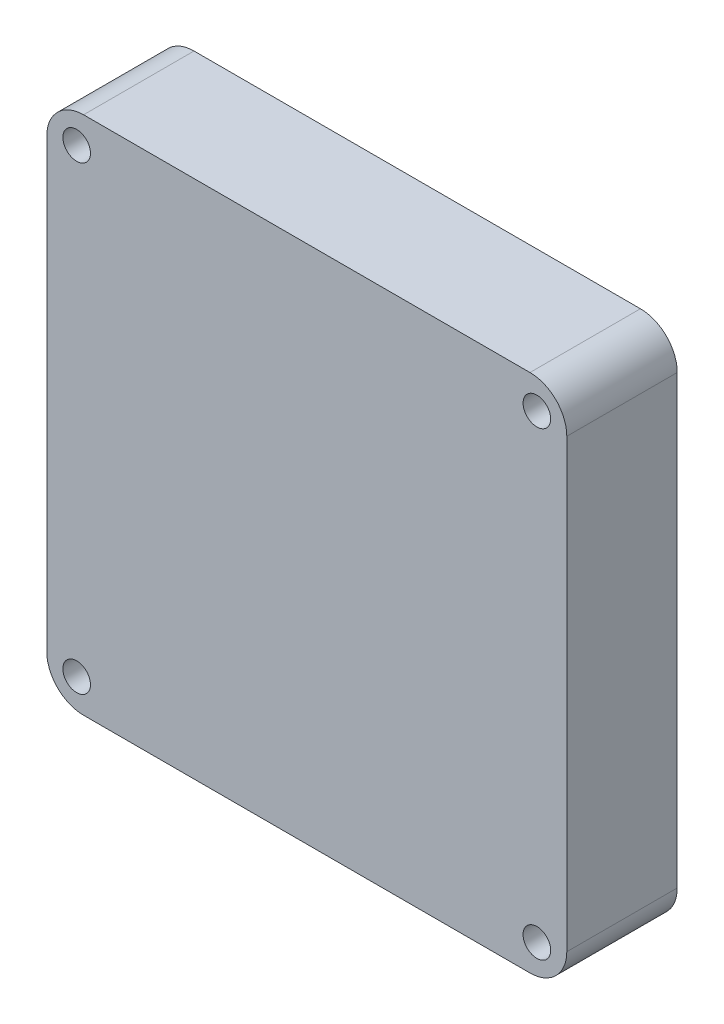
ISO-10303-21;
HEADER;
FILE_DESCRIPTION(('STEP AP214'),'2;1');
FILE_NAME('part.step','',(''),(''),'','','');
FILE_SCHEMA(('AUTOMOTIVE_DESIGN { 1 0 10303 214 1 1 1 1 }'));
ENDSEC;
DATA;
#1=APPLICATION_CONTEXT('core data for automotive mechanical design processes');
#2=APPLICATION_PROTOCOL_DEFINITION('international standard','automotive_design',2000,#1);
#3=PRODUCT_CONTEXT('',#1,'mechanical');
#4=PRODUCT('Part','Part','',(#3));
#5=PRODUCT_RELATED_PRODUCT_CATEGORY('part','',(#4));
#6=PRODUCT_DEFINITION_FORMATION('','',#4);
#7=PRODUCT_DEFINITION_CONTEXT('part definition',#1,'design');
#8=PRODUCT_DEFINITION('design','',#6,#7);
#9=PRODUCT_DEFINITION_SHAPE('','',#8);
#10=(LENGTH_UNIT() NAMED_UNIT(*) SI_UNIT(.MILLI.,.METRE.));
#11=(NAMED_UNIT(*) PLANE_ANGLE_UNIT() SI_UNIT($,.RADIAN.));
#12=(NAMED_UNIT(*) SI_UNIT($,.STERADIAN.) SOLID_ANGLE_UNIT());
#13=UNCERTAINTY_MEASURE_WITH_UNIT(LENGTH_MEASURE(1.E-05),#10,'distance_accuracy_value','');
#14=(GEOMETRIC_REPRESENTATION_CONTEXT(3) GLOBAL_UNCERTAINTY_ASSIGNED_CONTEXT((#13)) GLOBAL_UNIT_ASSIGNED_CONTEXT((#10,
#11,#12)) REPRESENTATION_CONTEXT('',''));
#15=CARTESIAN_POINT('',(0.,0.,0.));
#16=DIRECTION('',(0.,0.,1.));
#17=DIRECTION('',(1.,0.,0.));
#18=AXIS2_PLACEMENT_3D('',#15,#16,#17);
#19=CARTESIAN_POINT('',(0.,0.,12.));
#20=DIRECTION('',(0.,0.,1.));
#21=DIRECTION('',(1.,0.,0.));
#22=AXIS2_PLACEMENT_3D('',#19,#20,#21);
#23=PLANE('',#22);
#24=CARTESIAN_POINT('',(25.0000000000001,-24.9999999999999,12.));
#25=DIRECTION('',(0.,0.,1.));
#26=DIRECTION('',(1.,0.,0.));
#27=AXIS2_PLACEMENT_3D('',#24,#25,#26);
#28=CIRCLE('',#27,1.5);
#29=CARTESIAN_POINT('',(26.5000000000001,-24.9999999999999,12.));
#30=VERTEX_POINT('',#29);
#31=EDGE_CURVE('E185',#30,#30,#28,.T.);
#32=ORIENTED_EDGE('',*,*,#31,.F.);
#33=EDGE_LOOP('',(#32));
#34=FACE_BOUND('',#33,.T.);
#35=CARTESIAN_POINT('',(-25.,25.,12.));
#36=DIRECTION('',(0.,0.,1.));
#37=DIRECTION('',(1.,0.,0.));
#38=AXIS2_PLACEMENT_3D('',#35,#36,#37);
#39=CIRCLE('',#38,1.5);
#40=CARTESIAN_POINT('',(-23.5,25.,12.));
#41=VERTEX_POINT('',#40);
#42=EDGE_CURVE('E169',#41,#41,#39,.T.);
#43=ORIENTED_EDGE('',*,*,#42,.F.);
#44=EDGE_LOOP('',(#43));
#45=FACE_BOUND('',#44,.T.);
#46=DIRECTION('',(0.,-1.,0.));
#47=VECTOR('',#46,1.);
#48=CARTESIAN_POINT('',(-28.25,28.25,12.));
#49=LINE('',#48,#47);
#50=CARTESIAN_POINT('',(-28.25,24.25,12.));
#51=VERTEX_POINT('',#50);
#52=CARTESIAN_POINT('',(-28.25,-24.25,12.));
#53=VERTEX_POINT('',#52);
#54=EDGE_CURVE('E173',#51,#53,#49,.T.);
#55=ORIENTED_EDGE('',*,*,#54,.T.);
#56=CARTESIAN_POINT('',(-24.25,-24.25,12.));
#57=DIRECTION('',(0.,0.,1.));
#58=DIRECTION('',(1.,0.,0.));
#59=AXIS2_PLACEMENT_3D('',#56,#57,#58);
#60=CIRCLE('',#59,4.);
#61=CARTESIAN_POINT('',(-24.25,-28.25,12.));
#62=VERTEX_POINT('',#61);
#63=EDGE_CURVE('E150',#53,#62,#60,.T.);
#64=ORIENTED_EDGE('',*,*,#63,.T.);
#65=DIRECTION('',(1.,0.,0.));
#66=VECTOR('',#65,1.);
#67=CARTESIAN_POINT('',(-28.25,-28.25,12.));
#68=LINE('',#67,#66);
#69=CARTESIAN_POINT('',(24.25,-28.25,12.));
#70=VERTEX_POINT('',#69);
#71=EDGE_CURVE('E121',#62,#70,#68,.T.);
#72=ORIENTED_EDGE('',*,*,#71,.T.);
#73=CARTESIAN_POINT('',(24.25,-24.25,12.));
#74=DIRECTION('',(0.,0.,1.));
#75=DIRECTION('',(1.,0.,0.));
#76=AXIS2_PLACEMENT_3D('',#73,#74,#75);
#77=CIRCLE('',#76,4.);
#78=CARTESIAN_POINT('',(28.25,-24.25,12.));
#79=VERTEX_POINT('',#78);
#80=EDGE_CURVE('E146',#70,#79,#77,.T.);
#81=ORIENTED_EDGE('',*,*,#80,.T.);
#82=DIRECTION('',(0.,1.,0.));
#83=VECTOR('',#82,1.);
#84=CARTESIAN_POINT('',(28.25,28.25,12.));
#85=LINE('',#84,#83);
#86=CARTESIAN_POINT('',(28.25,24.25,12.));
#87=VERTEX_POINT('',#86);
#88=EDGE_CURVE('E129',#79,#87,#85,.T.);
#89=ORIENTED_EDGE('',*,*,#88,.T.);
#90=CARTESIAN_POINT('',(24.25,24.25,12.));
#91=DIRECTION('',(0.,0.,1.));
#92=DIRECTION('',(1.,0.,0.));
#93=AXIS2_PLACEMENT_3D('',#90,#91,#92);
#94=CIRCLE('',#93,4.);
#95=CARTESIAN_POINT('',(24.25,28.25,12.));
#96=VERTEX_POINT('',#95);
#97=EDGE_CURVE('E56',#87,#96,#94,.T.);
#98=ORIENTED_EDGE('',*,*,#97,.T.);
#99=DIRECTION('',(-1.,0.,0.));
#100=VECTOR('',#99,1.);
#101=CARTESIAN_POINT('',(-28.25,28.25,12.));
#102=LINE('',#101,#100);
#103=CARTESIAN_POINT('',(-24.25,28.25,12.));
#104=VERTEX_POINT('',#103);
#105=EDGE_CURVE('E132',#96,#104,#102,.T.);
#106=ORIENTED_EDGE('',*,*,#105,.T.);
#107=CARTESIAN_POINT('',(-24.25,24.25,12.));
#108=DIRECTION('',(0.,0.,1.));
#109=DIRECTION('',(1.,0.,0.));
#110=AXIS2_PLACEMENT_3D('',#107,#108,#109);
#111=CIRCLE('',#110,4.);
#112=EDGE_CURVE('E148',#104,#51,#111,.T.);
#113=ORIENTED_EDGE('',*,*,#112,.T.);
#114=EDGE_LOOP('',(#55,#64,#72,#81,#89,#98,#106,#113));
#115=FACE_BOUND('',#114,.T.);
#116=CARTESIAN_POINT('',(25.0000000000001,25.0000000000001,12.));
#117=DIRECTION('',(0.,0.,1.));
#118=DIRECTION('',(1.,0.,0.));
#119=AXIS2_PLACEMENT_3D('',#116,#117,#118);
#120=CIRCLE('',#119,1.5);
#121=CARTESIAN_POINT('',(26.5000000000001,25.0000000000001,12.));
#122=VERTEX_POINT('',#121);
#123=EDGE_CURVE('E179',#122,#122,#120,.T.);
#124=ORIENTED_EDGE('',*,*,#123,.F.);
#125=EDGE_LOOP('',(#124));
#126=FACE_BOUND('',#125,.T.);
#127=CARTESIAN_POINT('',(-24.9999999999999,-24.9999999999999,12.));
#128=DIRECTION('',(0.,0.,1.));
#129=DIRECTION('',(1.,0.,0.));
#130=AXIS2_PLACEMENT_3D('',#127,#128,#129);
#131=CIRCLE('',#130,1.5);
#132=CARTESIAN_POINT('',(-23.4999999999999,-24.9999999999999,12.));
#133=VERTEX_POINT('',#132);
#134=EDGE_CURVE('E191',#133,#133,#131,.T.);
#135=ORIENTED_EDGE('',*,*,#134,.F.);
#136=EDGE_LOOP('',(#135));
#137=FACE_BOUND('',#136,.T.);
#138=ADVANCED_FACE('F34',(#34,#45,#115,#126,#137),#23,.T.);
#139=CARTESIAN_POINT('',(0.,0.,0.));
#140=DIRECTION('',(0.,0.,1.));
#141=DIRECTION('',(1.,0.,0.));
#142=AXIS2_PLACEMENT_3D('',#139,#140,#141);
#143=PLANE('',#142);
#144=DIRECTION('',(1.,0.,0.));
#145=VECTOR('',#144,1.);
#146=CARTESIAN_POINT('',(-28.25,-28.25,0.));
#147=LINE('',#146,#145);
#148=CARTESIAN_POINT('',(-24.25,-28.25,0.));
#149=VERTEX_POINT('',#148);
#150=CARTESIAN_POINT('',(24.25,-28.25,0.));
#151=VERTEX_POINT('',#150);
#152=EDGE_CURVE('E118',#149,#151,#147,.T.);
#153=ORIENTED_EDGE('',*,*,#152,.F.);
#154=CARTESIAN_POINT('',(-24.25,-24.25,0.));
#155=DIRECTION('',(0.,0.,1.));
#156=DIRECTION('',(1.,0.,0.));
#157=AXIS2_PLACEMENT_3D('',#154,#155,#156);
#158=CIRCLE('',#157,4.);
#159=CARTESIAN_POINT('',(-28.25,-24.25,0.));
#160=VERTEX_POINT('',#159);
#161=EDGE_CURVE('E101',#149,#160,#158,.F.);
#162=ORIENTED_EDGE('',*,*,#161,.T.);
#163=DIRECTION('',(0.,-1.,0.));
#164=VECTOR('',#163,1.);
#165=CARTESIAN_POINT('',(-28.25,28.25,0.));
#166=LINE('',#165,#164);
#167=CARTESIAN_POINT('',(-28.25,24.25,0.));
#168=VERTEX_POINT('',#167);
#169=EDGE_CURVE('E130',#168,#160,#166,.T.);
#170=ORIENTED_EDGE('',*,*,#169,.F.);
#171=CARTESIAN_POINT('',(-24.25,24.25,0.));
#172=DIRECTION('',(0.,0.,1.));
#173=DIRECTION('',(1.,0.,0.));
#174=AXIS2_PLACEMENT_3D('',#171,#172,#173);
#175=CIRCLE('',#174,4.);
#176=CARTESIAN_POINT('',(-24.25,28.25,0.));
#177=VERTEX_POINT('',#176);
#178=EDGE_CURVE('E112',#168,#177,#175,.F.);
#179=ORIENTED_EDGE('',*,*,#178,.T.);
#180=DIRECTION('',(-1.,0.,0.));
#181=VECTOR('',#180,1.);
#182=CARTESIAN_POINT('',(-28.25,28.25,0.));
#183=LINE('',#182,#181);
#184=CARTESIAN_POINT('',(24.25,28.25,0.));
#185=VERTEX_POINT('',#184);
#186=EDGE_CURVE('E134',#185,#177,#183,.T.);
#187=ORIENTED_EDGE('',*,*,#186,.F.);
#188=CARTESIAN_POINT('',(24.25,24.25,0.));
#189=DIRECTION('',(0.,0.,1.));
#190=DIRECTION('',(1.,0.,0.));
#191=AXIS2_PLACEMENT_3D('',#188,#189,#190);
#192=CIRCLE('',#191,4.);
#193=CARTESIAN_POINT('',(28.25,24.25,0.));
#194=VERTEX_POINT('',#193);
#195=EDGE_CURVE('E122',#185,#194,#192,.F.);
#196=ORIENTED_EDGE('',*,*,#195,.T.);
#197=DIRECTION('',(0.,1.,0.));
#198=VECTOR('',#197,1.);
#199=CARTESIAN_POINT('',(28.25,28.25,0.));
#200=LINE('',#199,#198);
#201=CARTESIAN_POINT('',(28.25,-24.25,0.));
#202=VERTEX_POINT('',#201);
#203=EDGE_CURVE('E161',#202,#194,#200,.T.);
#204=ORIENTED_EDGE('',*,*,#203,.F.);
#205=CARTESIAN_POINT('',(24.25,-24.25,0.));
#206=DIRECTION('',(0.,0.,1.));
#207=DIRECTION('',(1.,0.,0.));
#208=AXIS2_PLACEMENT_3D('',#205,#206,#207);
#209=CIRCLE('',#208,4.);
#210=EDGE_CURVE('E128',#202,#151,#209,.F.);
#211=ORIENTED_EDGE('',*,*,#210,.T.);
#212=EDGE_LOOP('',(#153,#162,#170,#179,#187,#196,#204,#211));
#213=FACE_BOUND('',#212,.T.);
#214=CARTESIAN_POINT('',(-25.,25.,0.));
#215=DIRECTION('',(0.,0.,1.));
#216=DIRECTION('',(1.,0.,0.));
#217=AXIS2_PLACEMENT_3D('',#214,#215,#216);
#218=CIRCLE('',#217,1.5);
#219=CARTESIAN_POINT('',(-23.5,25.,0.));
#220=VERTEX_POINT('',#219);
#221=EDGE_CURVE('E176',#220,#220,#218,.T.);
#222=ORIENTED_EDGE('',*,*,#221,.T.);
#223=EDGE_LOOP('',(#222));
#224=FACE_BOUND('',#223,.T.);
#225=CARTESIAN_POINT('',(25.0000000000001,25.0000000000001,0.));
#226=DIRECTION('',(0.,0.,1.));
#227=DIRECTION('',(1.,0.,0.));
#228=AXIS2_PLACEMENT_3D('',#225,#226,#227);
#229=CIRCLE('',#228,1.5);
#230=CARTESIAN_POINT('',(26.5000000000001,25.0000000000001,0.));
#231=VERTEX_POINT('',#230);
#232=EDGE_CURVE('E182',#231,#231,#229,.T.);
#233=ORIENTED_EDGE('',*,*,#232,.T.);
#234=EDGE_LOOP('',(#233));
#235=FACE_BOUND('',#234,.T.);
#236=CARTESIAN_POINT('',(25.0000000000001,-24.9999999999999,0.));
#237=DIRECTION('',(0.,0.,1.));
#238=DIRECTION('',(1.,0.,0.));
#239=AXIS2_PLACEMENT_3D('',#236,#237,#238);
#240=CIRCLE('',#239,1.5);
#241=CARTESIAN_POINT('',(26.5000000000001,-24.9999999999999,0.));
#242=VERTEX_POINT('',#241);
#243=EDGE_CURVE('E188',#242,#242,#240,.T.);
#244=ORIENTED_EDGE('',*,*,#243,.T.);
#245=EDGE_LOOP('',(#244));
#246=FACE_BOUND('',#245,.T.);
#247=CARTESIAN_POINT('',(-24.9999999999999,-24.9999999999999,0.));
#248=DIRECTION('',(0.,0.,1.));
#249=DIRECTION('',(1.,0.,0.));
#250=AXIS2_PLACEMENT_3D('',#247,#248,#249);
#251=CIRCLE('',#250,1.5);
#252=CARTESIAN_POINT('',(-23.4999999999999,-24.9999999999999,0.));
#253=VERTEX_POINT('',#252);
#254=EDGE_CURVE('E194',#253,#253,#251,.T.);
#255=ORIENTED_EDGE('',*,*,#254,.T.);
#256=EDGE_LOOP('',(#255));
#257=FACE_BOUND('',#256,.T.);
#258=ADVANCED_FACE('F125',(#213,#224,#235,#246,#257),#143,.F.);
#259=CARTESIAN_POINT('',(28.25,28.25,12.));
#260=DIRECTION('',(-1.,0.,0.));
#261=DIRECTION('',(0.,-1.,0.));
#262=AXIS2_PLACEMENT_3D('',#259,#260,#261);
#263=PLANE('',#262);
#264=ORIENTED_EDGE('',*,*,#88,.F.);
#265=DIRECTION('',(0.,0.,-1.));
#266=VECTOR('',#265,1.);
#267=CARTESIAN_POINT('',(28.25,-24.25,12.));
#268=LINE('',#267,#266);
#269=EDGE_CURVE('E11',#79,#202,#268,.T.);
#270=ORIENTED_EDGE('',*,*,#269,.T.);
#271=ORIENTED_EDGE('',*,*,#203,.T.);
#272=DIRECTION('',(0.,0.,-1.));
#273=VECTOR('',#272,1.);
#274=CARTESIAN_POINT('',(28.25,24.25,12.));
#275=LINE('',#274,#273);
#276=EDGE_CURVE('E42',#194,#87,#275,.F.);
#277=ORIENTED_EDGE('',*,*,#276,.T.);
#278=EDGE_LOOP('',(#264,#270,#271,#277));
#279=FACE_BOUND('',#278,.T.);
#280=ADVANCED_FACE('F159',(#279),#263,.F.);
#281=CARTESIAN_POINT('',(-28.25,28.25,12.));
#282=DIRECTION('',(0.,-1.,0.));
#283=DIRECTION('',(0.,0.,-1.));
#284=AXIS2_PLACEMENT_3D('',#281,#282,#283);
#285=PLANE('',#284);
#286=ORIENTED_EDGE('',*,*,#186,.T.);
#287=DIRECTION('',(0.,0.,-1.));
#288=VECTOR('',#287,1.);
#289=CARTESIAN_POINT('',(-24.25,28.25,12.));
#290=LINE('',#289,#288);
#291=EDGE_CURVE('E49',#177,#104,#290,.F.);
#292=ORIENTED_EDGE('',*,*,#291,.T.);
#293=ORIENTED_EDGE('',*,*,#105,.F.);
#294=DIRECTION('',(0.,0.,-1.));
#295=VECTOR('',#294,1.);
#296=CARTESIAN_POINT('',(24.25,28.25,12.));
#297=LINE('',#296,#295);
#298=EDGE_CURVE('E152',#96,#185,#297,.T.);
#299=ORIENTED_EDGE('',*,*,#298,.T.);
#300=EDGE_LOOP('',(#286,#292,#293,#299));
#301=FACE_BOUND('',#300,.T.);
#302=ADVANCED_FACE('F168',(#301),#285,.F.);
#303=CARTESIAN_POINT('',(-28.25,28.25,12.));
#304=DIRECTION('',(1.,0.,0.));
#305=DIRECTION('',(0.,1.,0.));
#306=AXIS2_PLACEMENT_3D('',#303,#304,#305);
#307=PLANE('',#306);
#308=ORIENTED_EDGE('',*,*,#169,.T.);
#309=DIRECTION('',(0.,0.,-1.));
#310=VECTOR('',#309,1.);
#311=CARTESIAN_POINT('',(-28.25,-24.25,12.));
#312=LINE('',#311,#310);
#313=EDGE_CURVE('E106',#160,#53,#312,.F.);
#314=ORIENTED_EDGE('',*,*,#313,.T.);
#315=ORIENTED_EDGE('',*,*,#54,.F.);
#316=DIRECTION('',(0.,0.,-1.));
#317=VECTOR('',#316,1.);
#318=CARTESIAN_POINT('',(-28.25,24.25,12.));
#319=LINE('',#318,#317);
#320=EDGE_CURVE('E111',#51,#168,#319,.T.);
#321=ORIENTED_EDGE('',*,*,#320,.T.);
#322=EDGE_LOOP('',(#308,#314,#315,#321));
#323=FACE_BOUND('',#322,.T.);
#324=ADVANCED_FACE('F218',(#323),#307,.F.);
#325=CARTESIAN_POINT('',(-28.25,-28.25,12.));
#326=DIRECTION('',(0.,1.,0.));
#327=DIRECTION('',(0.,0.,1.));
#328=AXIS2_PLACEMENT_3D('',#325,#326,#327);
#329=PLANE('',#328);
#330=ORIENTED_EDGE('',*,*,#71,.F.);
#331=DIRECTION('',(0.,0.,-1.));
#332=VECTOR('',#331,1.);
#333=CARTESIAN_POINT('',(-24.25,-28.25,12.));
#334=LINE('',#333,#332);
#335=EDGE_CURVE('E105',#62,#149,#334,.T.);
#336=ORIENTED_EDGE('',*,*,#335,.T.);
#337=ORIENTED_EDGE('',*,*,#152,.T.);
#338=DIRECTION('',(0.,0.,-1.));
#339=VECTOR('',#338,1.);
#340=CARTESIAN_POINT('',(24.25,-28.25,12.));
#341=LINE('',#340,#339);
#342=EDGE_CURVE('E123',#151,#70,#341,.F.);
#343=ORIENTED_EDGE('',*,*,#342,.T.);
#344=EDGE_LOOP('',(#330,#336,#337,#343));
#345=FACE_BOUND('',#344,.T.);
#346=ADVANCED_FACE('F117',(#345),#329,.F.);
#347=CARTESIAN_POINT('',(-25.,25.,12.));
#348=DIRECTION('',(0.,0.,-1.));
#349=DIRECTION('',(-1.,0.,0.));
#350=AXIS2_PLACEMENT_3D('',#347,#348,#349);
#351=CYLINDRICAL_SURFACE('',#350,1.5);
#352=ORIENTED_EDGE('',*,*,#42,.T.);
#353=EDGE_LOOP('',(#352));
#354=FACE_BOUND('',#353,.T.);
#355=ORIENTED_EDGE('',*,*,#221,.F.);
#356=EDGE_LOOP('',(#355));
#357=FACE_BOUND('',#356,.T.);
#358=ADVANCED_FACE('F213',(#354,#357),#351,.F.);
#359=CARTESIAN_POINT('',(25.0000000000001,25.0000000000001,12.));
#360=DIRECTION('',(0.,0.,-1.));
#361=DIRECTION('',(-1.,0.,0.));
#362=AXIS2_PLACEMENT_3D('',#359,#360,#361);
#363=CYLINDRICAL_SURFACE('',#362,1.5);
#364=ORIENTED_EDGE('',*,*,#123,.T.);
#365=EDGE_LOOP('',(#364));
#366=FACE_BOUND('',#365,.T.);
#367=ORIENTED_EDGE('',*,*,#232,.F.);
#368=EDGE_LOOP('',(#367));
#369=FACE_BOUND('',#368,.T.);
#370=ADVANCED_FACE('F312',(#366,#369),#363,.F.);
#371=CARTESIAN_POINT('',(25.0000000000001,-24.9999999999999,12.));
#372=DIRECTION('',(0.,0.,-1.));
#373=DIRECTION('',(-1.,0.,0.));
#374=AXIS2_PLACEMENT_3D('',#371,#372,#373);
#375=CYLINDRICAL_SURFACE('',#374,1.5);
#376=ORIENTED_EDGE('',*,*,#31,.T.);
#377=EDGE_LOOP('',(#376));
#378=FACE_BOUND('',#377,.T.);
#379=ORIENTED_EDGE('',*,*,#243,.F.);
#380=EDGE_LOOP('',(#379));
#381=FACE_BOUND('',#380,.T.);
#382=ADVANCED_FACE('F303',(#378,#381),#375,.F.);
#383=CARTESIAN_POINT('',(-24.9999999999999,-24.9999999999999,12.));
#384=DIRECTION('',(0.,0.,-1.));
#385=DIRECTION('',(-1.,0.,0.));
#386=AXIS2_PLACEMENT_3D('',#383,#384,#385);
#387=CYLINDRICAL_SURFACE('',#386,1.5);
#388=ORIENTED_EDGE('',*,*,#134,.T.);
#389=EDGE_LOOP('',(#388));
#390=FACE_BOUND('',#389,.T.);
#391=ORIENTED_EDGE('',*,*,#254,.F.);
#392=EDGE_LOOP('',(#391));
#393=FACE_BOUND('',#392,.T.);
#394=ADVANCED_FACE('F200',(#390,#393),#387,.F.);
#395=CARTESIAN_POINT('',(-24.25,-24.25,12.));
#396=DIRECTION('',(0.,0.,-1.));
#397=DIRECTION('',(-1.,0.,0.));
#398=AXIS2_PLACEMENT_3D('',#395,#396,#397);
#399=CYLINDRICAL_SURFACE('',#398,4.);
#400=ORIENTED_EDGE('',*,*,#63,.F.);
#401=ORIENTED_EDGE('',*,*,#313,.F.);
#402=ORIENTED_EDGE('',*,*,#161,.F.);
#403=ORIENTED_EDGE('',*,*,#335,.F.);
#404=EDGE_LOOP('',(#400,#401,#402,#403));
#405=FACE_BOUND('',#404,.T.);
#406=ADVANCED_FACE('F104',(#405),#399,.T.);
#407=CARTESIAN_POINT('',(-24.25,24.25,12.));
#408=DIRECTION('',(0.,0.,-1.));
#409=DIRECTION('',(-1.,0.,0.));
#410=AXIS2_PLACEMENT_3D('',#407,#408,#409);
#411=CYLINDRICAL_SURFACE('',#410,4.);
#412=ORIENTED_EDGE('',*,*,#112,.F.);
#413=ORIENTED_EDGE('',*,*,#291,.F.);
#414=ORIENTED_EDGE('',*,*,#178,.F.);
#415=ORIENTED_EDGE('',*,*,#320,.F.);
#416=EDGE_LOOP('',(#412,#413,#414,#415));
#417=FACE_BOUND('',#416,.T.);
#418=ADVANCED_FACE('F228',(#417),#411,.T.);
#419=CARTESIAN_POINT('',(24.25,-24.25,12.));
#420=DIRECTION('',(0.,0.,-1.));
#421=DIRECTION('',(-1.,0.,0.));
#422=AXIS2_PLACEMENT_3D('',#419,#420,#421);
#423=CYLINDRICAL_SURFACE('',#422,4.);
#424=ORIENTED_EDGE('',*,*,#80,.F.);
#425=ORIENTED_EDGE('',*,*,#342,.F.);
#426=ORIENTED_EDGE('',*,*,#210,.F.);
#427=ORIENTED_EDGE('',*,*,#269,.F.);
#428=EDGE_LOOP('',(#424,#425,#426,#427));
#429=FACE_BOUND('',#428,.T.);
#430=ADVANCED_FACE('F230',(#429),#423,.T.);
#431=CARTESIAN_POINT('',(24.25,24.25,12.));
#432=DIRECTION('',(0.,0.,-1.));
#433=DIRECTION('',(-1.,0.,0.));
#434=AXIS2_PLACEMENT_3D('',#431,#432,#433);
#435=CYLINDRICAL_SURFACE('',#434,4.);
#436=ORIENTED_EDGE('',*,*,#97,.F.);
#437=ORIENTED_EDGE('',*,*,#276,.F.);
#438=ORIENTED_EDGE('',*,*,#195,.F.);
#439=ORIENTED_EDGE('',*,*,#298,.F.);
#440=EDGE_LOOP('',(#436,#437,#438,#439));
#441=FACE_BOUND('',#440,.T.);
#442=ADVANCED_FACE('F36',(#441),#435,.T.);
#443=CLOSED_SHELL('',(#138,#258,#280,#302,#324,#346,#358,#370,#382,#394,#406,#418,#430,#442));
#444=MANIFOLD_SOLID_BREP('B2',#443);
#445=ADVANCED_BREP_SHAPE_REPRESENTATION('',(#18,#444),#14);
#446=SHAPE_DEFINITION_REPRESENTATION(#9,#445);
ENDSEC;
END-ISO-10303-21;
